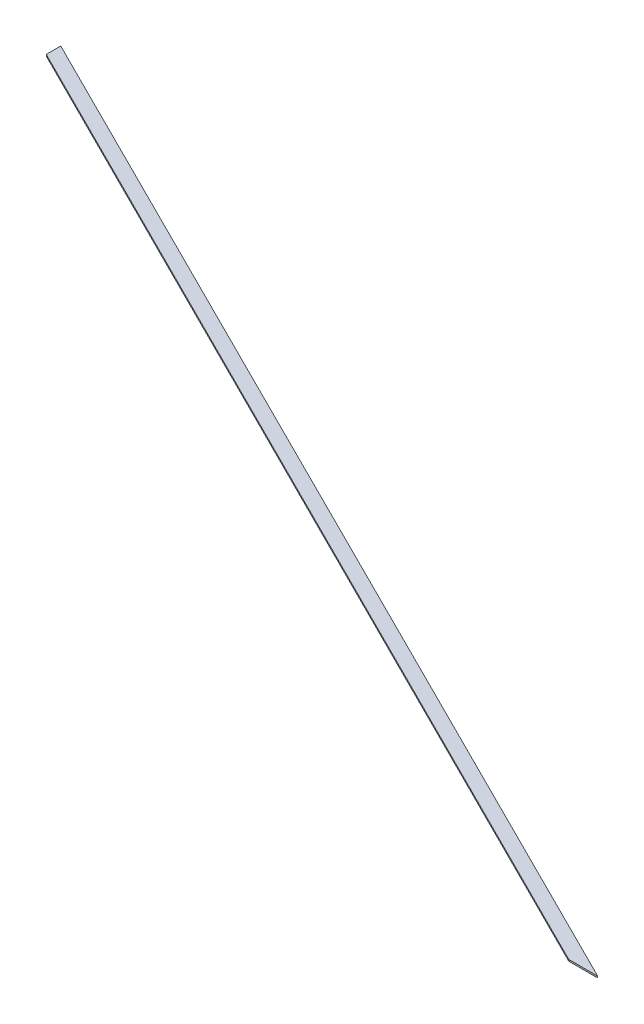
ISO-10303-21;
HEADER;
FILE_DESCRIPTION(('STEP AP214'),'2;1');
FILE_NAME('part.step','',(''),(''),'','','');
FILE_SCHEMA(('AUTOMOTIVE_DESIGN { 1 0 10303 214 1 1 1 1 }'));
ENDSEC;
DATA;
#1=APPLICATION_CONTEXT('core data for automotive mechanical design processes');
#2=APPLICATION_PROTOCOL_DEFINITION('international standard','automotive_design',2000,#1);
#3=PRODUCT_CONTEXT('',#1,'mechanical');
#4=PRODUCT('Part','Part','',(#3));
#5=PRODUCT_RELATED_PRODUCT_CATEGORY('part','',(#4));
#6=PRODUCT_DEFINITION_FORMATION('','',#4);
#7=PRODUCT_DEFINITION_CONTEXT('part definition',#1,'design');
#8=PRODUCT_DEFINITION('design','',#6,#7);
#9=PRODUCT_DEFINITION_SHAPE('','',#8);
#10=(LENGTH_UNIT() NAMED_UNIT(*) SI_UNIT(.MILLI.,.METRE.));
#11=(NAMED_UNIT(*) PLANE_ANGLE_UNIT() SI_UNIT($,.RADIAN.));
#12=(NAMED_UNIT(*) SI_UNIT($,.STERADIAN.) SOLID_ANGLE_UNIT());
#13=UNCERTAINTY_MEASURE_WITH_UNIT(LENGTH_MEASURE(1.E-05),#10,'distance_accuracy_value','');
#14=(GEOMETRIC_REPRESENTATION_CONTEXT(3) GLOBAL_UNCERTAINTY_ASSIGNED_CONTEXT((#13)) GLOBAL_UNIT_ASSIGNED_CONTEXT((#10,
#11,#12)) REPRESENTATION_CONTEXT('',''));
#15=CARTESIAN_POINT('',(0.,0.,0.));
#16=DIRECTION('',(0.,0.,1.));
#17=DIRECTION('',(1.,0.,0.));
#18=AXIS2_PLACEMENT_3D('',#15,#16,#17);
#19=CARTESIAN_POINT('',(0.,0.,0.));
#20=DIRECTION('',(0.,1.,0.));
#21=DIRECTION('',(0.,0.,1.));
#22=AXIS2_PLACEMENT_3D('',#19,#20,#21);
#23=PLANE('',#22);
#24=DIRECTION('',(0.,0.,1.));
#25=VECTOR('',#24,1.);
#26=CARTESIAN_POINT('',(0.,0.,-2107.1186591985));
#27=LINE('',#26,#25);
#28=CARTESIAN_POINT('',(1.99730010308462E-11,0.,-2107.11865919875));
#29=VERTEX_POINT('',#28);
#30=CARTESIAN_POINT('',(1.54344803604502E-11,0.,-2050.32253256999));
#31=VERTEX_POINT('',#30);
#32=EDGE_CURVE('E78',#29,#31,#27,.T.);
#33=ORIENTED_EDGE('',*,*,#32,.F.);
#34=DIRECTION('',(-0.894427190999896,0.,-0.447213595499998));
#35=VECTOR('',#34,1.);
#36=CARTESIAN_POINT('',(4214.237318397,0.,0.));
#37=LINE('',#36,#35);
#38=CARTESIAN_POINT('',(4214.23731839706,0.,3.02215141800833E-11));
#39=VERTEX_POINT('',#38);
#40=EDGE_CURVE('E54',#39,#29,#37,.T.);
#41=ORIENTED_EDGE('',*,*,#40,.F.);
#42=DIRECTION('',(1.,0.,0.));
#43=VECTOR('',#42,1.);
#44=CARTESIAN_POINT('',(4100.64506514,0.,0.));
#45=LINE('',#44,#43);
#46=CARTESIAN_POINT('',(4100.64506513998,0.,7.94004861859299E-11));
#47=VERTEX_POINT('',#46);
#48=EDGE_CURVE('E56',#47,#39,#45,.T.);
#49=ORIENTED_EDGE('',*,*,#48,.F.);
#50=DIRECTION('',(0.894427190999896,0.,0.447213595499998));
#51=VECTOR('',#50,1.);
#52=CARTESIAN_POINT('',(0.,0.,-2050.32253257));
#53=LINE('',#52,#51);
#54=EDGE_CURVE('E19',#31,#47,#53,.T.);
#55=ORIENTED_EDGE('',*,*,#54,.F.);
#56=EDGE_LOOP('',(#33,#41,#49,#55));
#57=FACE_BOUND('',#56,.T.);
#58=ADVANCED_FACE('F16',(#57),#23,.F.);
#59=CARTESIAN_POINT('',(0.,0.,-2050.32253257));
#60=DIRECTION('',(-0.447213595499998,0.,0.894427190999896));
#61=DIRECTION('',(0.894427190999896,0.,0.447213595499998));
#62=AXIS2_PLACEMENT_3D('',#59,#60,#61);
#63=PLANE('',#62);
#64=DIRECTION('',(0.89442719099991,0.,0.447213595499969));
#65=VECTOR('',#64,1.);
#66=CARTESIAN_POINT('',(0.,6.35,-2050.32253257));
#67=LINE('',#66,#65);
#68=CARTESIAN_POINT('',(7.75923349443361E-12,6.35,-2050.32253257));
#69=VERTEX_POINT('',#68);
#70=CARTESIAN_POINT('',(4100.64506513997,6.35,1.13015434048219E-10));
#71=VERTEX_POINT('',#70);
#72=EDGE_CURVE('E82',#69,#71,#67,.T.);
#73=ORIENTED_EDGE('',*,*,#72,.F.);
#74=DIRECTION('',(0.,1.,0.));
#75=VECTOR('',#74,1.);
#76=CARTESIAN_POINT('',(0.,0.,-2050.32253257));
#77=LINE('',#76,#75);
#78=EDGE_CURVE('E67',#31,#69,#77,.T.);
#79=ORIENTED_EDGE('',*,*,#78,.F.);
#80=ORIENTED_EDGE('',*,*,#54,.T.);
#81=DIRECTION('',(0.,1.,0.));
#82=VECTOR('',#81,1.);
#83=CARTESIAN_POINT('',(4100.64506514,0.,0.));
#84=LINE('',#83,#82);
#85=EDGE_CURVE('E62',#71,#47,#84,.F.);
#86=ORIENTED_EDGE('',*,*,#85,.F.);
#87=EDGE_LOOP('',(#73,#79,#80,#86));
#88=FACE_BOUND('',#87,.T.);
#89=ADVANCED_FACE('F64',(#88),#63,.T.);
#90=CARTESIAN_POINT('',(4100.64506514,0.,0.));
#91=DIRECTION('',(0.,0.,1.));
#92=DIRECTION('',(1.,0.,0.));
#93=AXIS2_PLACEMENT_3D('',#90,#91,#92);
#94=PLANE('',#93);
#95=DIRECTION('',(1.,0.,0.));
#96=VECTOR('',#95,1.);
#97=CARTESIAN_POINT('',(0.,6.35,6.12421520903302E-11));
#98=LINE('',#97,#96);
#99=CARTESIAN_POINT('',(4214.23731839703,6.35,1.50927093045561E-11));
#100=VERTEX_POINT('',#99);
#101=EDGE_CURVE('E71',#71,#100,#98,.T.);
#102=ORIENTED_EDGE('',*,*,#101,.F.);
#103=ORIENTED_EDGE('',*,*,#85,.T.);
#104=ORIENTED_EDGE('',*,*,#48,.T.);
#105=DIRECTION('',(0.,1.,0.));
#106=VECTOR('',#105,1.);
#107=CARTESIAN_POINT('',(4214.237318397,0.,0.));
#108=LINE('',#107,#106);
#109=EDGE_CURVE('E74',#100,#39,#108,.F.);
#110=ORIENTED_EDGE('',*,*,#109,.F.);
#111=EDGE_LOOP('',(#102,#103,#104,#110));
#112=FACE_BOUND('',#111,.T.);
#113=ADVANCED_FACE('F69',(#112),#94,.T.);
#114=CARTESIAN_POINT('',(4214.237318397,0.,0.));
#115=DIRECTION('',(0.447213595499998,0.,-0.894427190999896));
#116=DIRECTION('',(-0.894427190999896,0.,-0.447213595499998));
#117=AXIS2_PLACEMENT_3D('',#114,#115,#116);
#118=PLANE('',#117);
#119=DIRECTION('',(-0.894427190999893,0.,-0.447213595500004));
#120=VECTOR('',#119,1.);
#121=CARTESIAN_POINT('',(4214.237318397,6.35,0.));
#122=LINE('',#121,#120);
#123=CARTESIAN_POINT('',(1.6647838663174E-11,6.35,-2107.11865919874));
#124=VERTEX_POINT('',#123);
#125=EDGE_CURVE('E25',#100,#124,#122,.T.);
#126=ORIENTED_EDGE('',*,*,#125,.F.);
#127=ORIENTED_EDGE('',*,*,#109,.T.);
#128=ORIENTED_EDGE('',*,*,#40,.T.);
#129=DIRECTION('',(0.,1.,0.));
#130=VECTOR('',#129,1.);
#131=CARTESIAN_POINT('',(0.,0.,-2107.11865919875));
#132=LINE('',#131,#130);
#133=EDGE_CURVE('E34',#124,#29,#132,.F.);
#134=ORIENTED_EDGE('',*,*,#133,.F.);
#135=EDGE_LOOP('',(#126,#127,#128,#134));
#136=FACE_BOUND('',#135,.T.);
#137=ADVANCED_FACE('F88',(#136),#118,.T.);
#138=CARTESIAN_POINT('',(0.,0.,-2107.1186591985));
#139=DIRECTION('',(-1.,0.,0.));
#140=DIRECTION('',(0.,0.,1.));
#141=AXIS2_PLACEMENT_3D('',#138,#139,#140);
#142=PLANE('',#141);
#143=DIRECTION('',(0.,0.,1.));
#144=VECTOR('',#143,1.);
#145=CARTESIAN_POINT('',(3.10421910398778E-11,6.35,0.));
#146=LINE('',#145,#144);
#147=EDGE_CURVE('E11',#124,#69,#146,.T.);
#148=ORIENTED_EDGE('',*,*,#147,.F.);
#149=ORIENTED_EDGE('',*,*,#133,.T.);
#150=ORIENTED_EDGE('',*,*,#32,.T.);
#151=ORIENTED_EDGE('',*,*,#78,.T.);
#152=EDGE_LOOP('',(#148,#149,#150,#151));
#153=FACE_BOUND('',#152,.T.);
#154=ADVANCED_FACE('F90',(#153),#142,.T.);
#155=CARTESIAN_POINT('',(0.,6.35,0.));
#156=DIRECTION('',(0.,1.,0.));
#157=DIRECTION('',(0.,0.,1.));
#158=AXIS2_PLACEMENT_3D('',#155,#156,#157);
#159=PLANE('',#158);
#160=ORIENTED_EDGE('',*,*,#125,.T.);
#161=ORIENTED_EDGE('',*,*,#147,.T.);
#162=ORIENTED_EDGE('',*,*,#72,.T.);
#163=ORIENTED_EDGE('',*,*,#101,.T.);
#164=EDGE_LOOP('',(#160,#161,#162,#163));
#165=FACE_BOUND('',#164,.T.);
#166=ADVANCED_FACE('F87',(#165),#159,.T.);
#167=CLOSED_SHELL('',(#58,#89,#113,#137,#154,#166));
#168=MANIFOLD_SOLID_BREP('B1',#167);
#169=ADVANCED_BREP_SHAPE_REPRESENTATION('',(#18,#168),#14);
#170=SHAPE_DEFINITION_REPRESENTATION(#9,#169);
ENDSEC;
END-ISO-10303-21;
